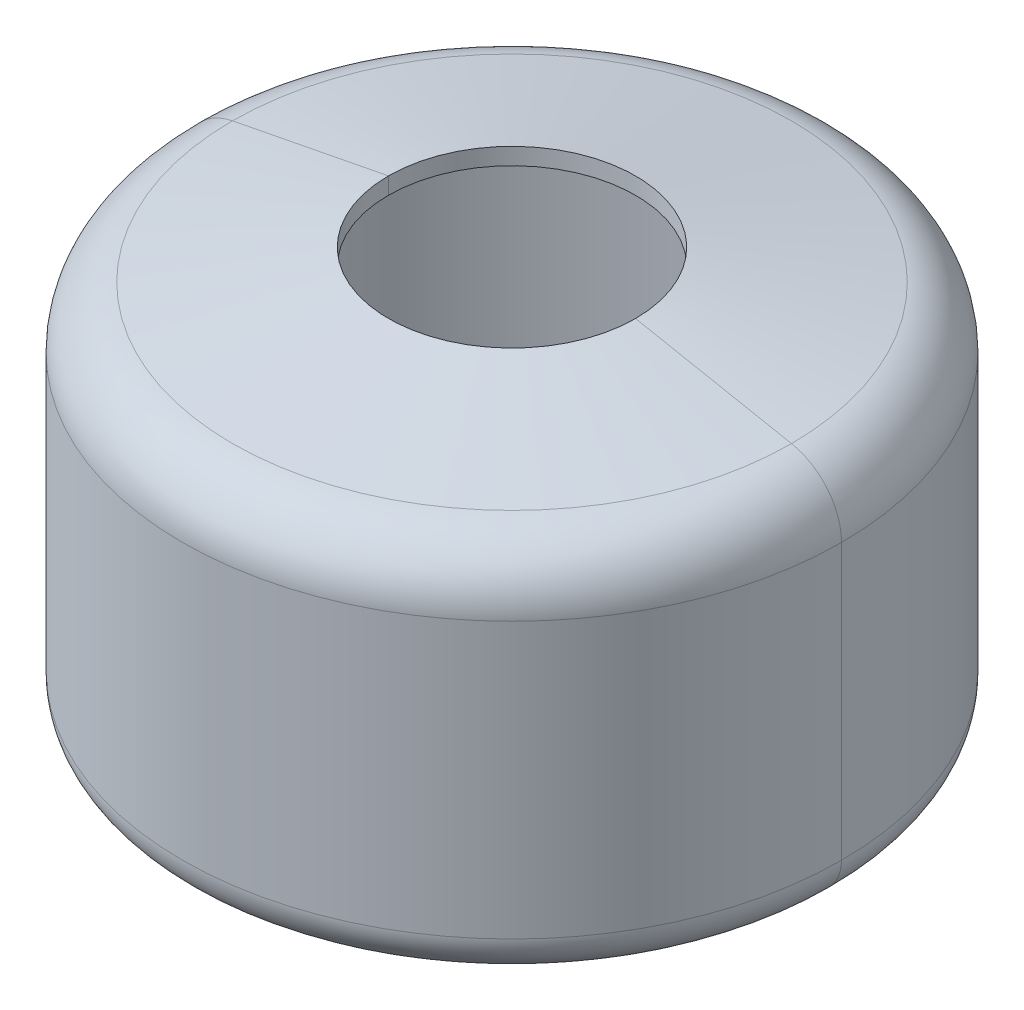
ISO-10303-21;
HEADER;
FILE_DESCRIPTION(('STEP AP214'),'2;1');
FILE_NAME('part.step','',(''),(''),'','','');
FILE_SCHEMA(('AUTOMOTIVE_DESIGN { 1 0 10303 214 1 1 1 1 }'));
ENDSEC;
DATA;
#1=APPLICATION_CONTEXT('core data for automotive mechanical design processes');
#2=APPLICATION_PROTOCOL_DEFINITION('international standard','automotive_design',2000,#1);
#3=PRODUCT_CONTEXT('',#1,'mechanical');
#4=PRODUCT('Part','Part','',(#3));
#5=PRODUCT_RELATED_PRODUCT_CATEGORY('part','',(#4));
#6=PRODUCT_DEFINITION_FORMATION('','',#4);
#7=PRODUCT_DEFINITION_CONTEXT('part definition',#1,'design');
#8=PRODUCT_DEFINITION('design','',#6,#7);
#9=PRODUCT_DEFINITION_SHAPE('','',#8);
#10=(LENGTH_UNIT() NAMED_UNIT(*) SI_UNIT(.MILLI.,.METRE.));
#11=(NAMED_UNIT(*) PLANE_ANGLE_UNIT() SI_UNIT($,.RADIAN.));
#12=(NAMED_UNIT(*) SI_UNIT($,.STERADIAN.) SOLID_ANGLE_UNIT());
#13=UNCERTAINTY_MEASURE_WITH_UNIT(LENGTH_MEASURE(1.E-05),#10,'distance_accuracy_value','');
#14=(GEOMETRIC_REPRESENTATION_CONTEXT(3) GLOBAL_UNCERTAINTY_ASSIGNED_CONTEXT((#13)) GLOBAL_UNIT_ASSIGNED_CONTEXT((#10,
#11,#12)) REPRESENTATION_CONTEXT('',''));
#15=CARTESIAN_POINT('',(0.,0.,0.));
#16=DIRECTION('',(0.,0.,1.));
#17=DIRECTION('',(1.,0.,0.));
#18=AXIS2_PLACEMENT_3D('',#15,#16,#17);
#19=CARTESIAN_POINT('',(0.,-4.999930684396,0.));
#20=DIRECTION('',(0.,-1.,0.));
#21=DIRECTION('',(1.,0.,0.));
#22=AXIS2_PLACEMENT_3D('',#19,#20,#21);
#23=CONICAL_SURFACE('',#22,2.97411809549,0.2617993877991);
#24=CARTESIAN_POINT('',(0.,-4.903338101767,0.));
#25=DIRECTION('',(0.,1.,0.));
#26=DIRECTION('',(-1.,0.,0.));
#27=AXIS2_PLACEMENT_3D('',#24,#25,#26);
#28=CIRCLE('',#27,2.948236190979);
#29=CARTESIAN_POINT('',(-2.948236190979,-4.903338101767,0.));
#30=VERTEX_POINT('',#29);
#31=CARTESIAN_POINT('',(2.948236190979,-4.903338101767,0.));
#32=VERTEX_POINT('',#31);
#33=EDGE_CURVE('E202',#30,#32,#28,.T.);
#34=ORIENTED_EDGE('',*,*,#33,.T.);
#35=DIRECTION('',(0.258819045102494,-0.965925826289076,0.));
#36=VECTOR('',#35,1.);
#37=CARTESIAN_POINT('',(2.948236190979,-4.903338101767,0.));
#38=LINE('',#37,#36);
#39=CARTESIAN_POINT('',(3.,-5.096523267025,0.));
#40=VERTEX_POINT('',#39);
#41=EDGE_CURVE('E26',#32,#40,#38,.T.);
#42=ORIENTED_EDGE('',*,*,#41,.T.);
#43=CARTESIAN_POINT('',(0.,-5.096523267025,0.));
#44=DIRECTION('',(0.,1.,0.));
#45=DIRECTION('',(-1.,0.,0.));
#46=AXIS2_PLACEMENT_3D('',#43,#44,#45);
#47=CIRCLE('',#46,3.);
#48=CARTESIAN_POINT('',(-3.,-5.096523267025,0.));
#49=VERTEX_POINT('',#48);
#50=EDGE_CURVE('E184',#49,#40,#47,.T.);
#51=ORIENTED_EDGE('',*,*,#50,.F.);
#52=DIRECTION('',(-0.258819045102494,-0.965925826289076,0.));
#53=VECTOR('',#52,1.);
#54=CARTESIAN_POINT('',(-2.948236190979,-4.903338101767,0.));
#55=LINE('',#54,#53);
#56=EDGE_CURVE('E11',#30,#49,#55,.T.);
#57=ORIENTED_EDGE('',*,*,#56,.F.);
#58=EDGE_LOOP('',(#34,#42,#51,#57));
#59=FACE_BOUND('',#58,.T.);
#60=ADVANCED_FACE('F16',(#59),#23,.F.);
#61=CARTESIAN_POINT('',(0.,-4.999930684396,0.));
#62=DIRECTION('',(0.,-1.,0.));
#63=DIRECTION('',(1.,0.,0.));
#64=AXIS2_PLACEMENT_3D('',#61,#62,#63);
#65=CONICAL_SURFACE('',#64,2.97411809549,0.2617993877991);
#66=CARTESIAN_POINT('',(0.,-5.096523267025,0.));
#67=DIRECTION('',(0.,-1.,0.));
#68=DIRECTION('',(-1.,0.,0.));
#69=AXIS2_PLACEMENT_3D('',#66,#67,#68);
#70=CIRCLE('',#69,3.);
#71=EDGE_CURVE('E178',#49,#40,#70,.T.);
#72=ORIENTED_EDGE('',*,*,#71,.T.);
#73=ORIENTED_EDGE('',*,*,#41,.F.);
#74=CARTESIAN_POINT('',(0.,-4.903338101767,0.));
#75=DIRECTION('',(0.,-1.,0.));
#76=DIRECTION('',(-1.,0.,0.));
#77=AXIS2_PLACEMENT_3D('',#74,#75,#76);
#78=CIRCLE('',#77,2.948236190979);
#79=EDGE_CURVE('E201',#30,#32,#78,.T.);
#80=ORIENTED_EDGE('',*,*,#79,.F.);
#81=ORIENTED_EDGE('',*,*,#56,.T.);
#82=EDGE_LOOP('',(#72,#73,#80,#81));
#83=FACE_BOUND('',#82,.T.);
#84=ADVANCED_FACE('F388',(#83),#65,.F.);
#85=CARTESIAN_POINT('',(0.,-4.819013215129,0.));
#86=DIRECTION('',(0.,1.,0.));
#87=DIRECTION('',(-1.,0.,0.));
#88=AXIS2_PLACEMENT_3D('',#85,#86,#87);
#89=CONICAL_SURFACE('',#88,3.262940952255,1.3089969389955);
#90=ORIENTED_EDGE('',*,*,#79,.T.);
#91=DIRECTION('',(-0.965925826289076,-0.258819045102494,0.));
#92=VECTOR('',#91,1.);
#93=CARTESIAN_POINT('',(3.577645713531,-4.734688328491,0.));
#94=LINE('',#93,#92);
#95=CARTESIAN_POINT('',(3.577645713531,-4.734688328491,0.));
#96=VERTEX_POINT('',#95);
#97=EDGE_CURVE('E339',#96,#32,#94,.T.);
#98=ORIENTED_EDGE('',*,*,#97,.F.);
#99=CARTESIAN_POINT('',(0.,-4.734688328491,0.));
#100=DIRECTION('',(0.,-1.,0.));
#101=DIRECTION('',(-1.,0.,0.));
#102=AXIS2_PLACEMENT_3D('',#99,#100,#101);
#103=CIRCLE('',#102,3.577645713531);
#104=CARTESIAN_POINT('',(-3.577645713531,-4.734688328491,0.));
#105=VERTEX_POINT('',#104);
#106=EDGE_CURVE('E316',#105,#96,#103,.T.);
#107=ORIENTED_EDGE('',*,*,#106,.F.);
#108=DIRECTION('',(0.965925826289076,-0.258819045102494,0.));
#109=VECTOR('',#108,1.);
#110=CARTESIAN_POINT('',(-3.577645713531,-4.734688328491,0.));
#111=LINE('',#110,#109);
#112=EDGE_CURVE('E197',#105,#30,#111,.T.);
#113=ORIENTED_EDGE('',*,*,#112,.T.);
#114=EDGE_LOOP('',(#90,#98,#107,#113));
#115=FACE_BOUND('',#114,.T.);
#116=ADVANCED_FACE('F392',(#115),#89,.F.);
#117=CARTESIAN_POINT('',(0.,-4.819013215129,0.));
#118=DIRECTION('',(0.,1.,0.));
#119=DIRECTION('',(-1.,0.,0.));
#120=AXIS2_PLACEMENT_3D('',#117,#118,#119);
#121=CONICAL_SURFACE('',#120,3.262940952255,1.3089969389955);
#122=CARTESIAN_POINT('',(0.,-4.734688328491,0.));
#123=DIRECTION('',(0.,1.,0.));
#124=DIRECTION('',(-1.,0.,0.));
#125=AXIS2_PLACEMENT_3D('',#122,#123,#124);
#126=CIRCLE('',#125,3.577645713531);
#127=EDGE_CURVE('E171',#105,#96,#126,.T.);
#128=ORIENTED_EDGE('',*,*,#127,.T.);
#129=ORIENTED_EDGE('',*,*,#97,.T.);
#130=ORIENTED_EDGE('',*,*,#33,.F.);
#131=ORIENTED_EDGE('',*,*,#112,.F.);
#132=EDGE_LOOP('',(#128,#129,#130,#131));
#133=FACE_BOUND('',#132,.T.);
#134=ADVANCED_FACE('F398',(#133),#121,.F.);
#135=CARTESIAN_POINT('',(0.,-4.444910580604,0.));
#136=DIRECTION('',(0.,-1.,0.));
#137=DIRECTION('',(1.,0.,0.));
#138=AXIS2_PLACEMENT_3D('',#135,#136,#137);
#139=TOROIDAL_SURFACE('',#138,3.5,0.3);
#140=CARTESIAN_POINT('',(0.,-4.444910580604,0.));
#141=DIRECTION('',(0.,1.,0.));
#142=DIRECTION('',(-1.,0.,0.));
#143=AXIS2_PLACEMENT_3D('',#140,#141,#142);
#144=CIRCLE('',#143,3.8);
#145=CARTESIAN_POINT('',(-3.8,-4.444910580604,0.));
#146=VERTEX_POINT('',#145);
#147=CARTESIAN_POINT('',(3.8,-4.444910580604,0.));
#148=VERTEX_POINT('',#147);
#149=EDGE_CURVE('E245',#146,#148,#144,.T.);
#150=ORIENTED_EDGE('',*,*,#149,.T.);
#151=CARTESIAN_POINT('',(3.5,-4.444910580604,0.));
#152=DIRECTION('',(0.,0.,-1.));
#153=DIRECTION('',(1.,0.,0.));
#154=AXIS2_PLACEMENT_3D('',#151,#152,#153);
#155=CIRCLE('',#154,0.3);
#156=EDGE_CURVE('E294',#148,#96,#155,.T.);
#157=ORIENTED_EDGE('',*,*,#156,.T.);
#158=ORIENTED_EDGE('',*,*,#127,.F.);
#159=CARTESIAN_POINT('',(-3.5,-4.444910580604,0.));
#160=DIRECTION('',(0.,0.,1.));
#161=DIRECTION('',(-1.,0.,0.));
#162=AXIS2_PLACEMENT_3D('',#159,#160,#161);
#163=CIRCLE('',#162,0.3);
#164=EDGE_CURVE('E323',#146,#105,#163,.T.);
#165=ORIENTED_EDGE('',*,*,#164,.F.);
#166=EDGE_LOOP('',(#150,#157,#158,#165));
#167=FACE_BOUND('',#166,.T.);
#168=ADVANCED_FACE('F320',(#167),#139,.F.);
#169=CARTESIAN_POINT('',(0.,-4.444910580604,0.));
#170=DIRECTION('',(0.,-1.,0.));
#171=DIRECTION('',(1.,0.,0.));
#172=AXIS2_PLACEMENT_3D('',#169,#170,#171);
#173=TOROIDAL_SURFACE('',#172,3.5,0.3);
#174=ORIENTED_EDGE('',*,*,#106,.T.);
#175=ORIENTED_EDGE('',*,*,#156,.F.);
#176=CARTESIAN_POINT('',(0.,-4.444910580604,0.));
#177=DIRECTION('',(0.,-1.,0.));
#178=DIRECTION('',(-1.,0.,0.));
#179=AXIS2_PLACEMENT_3D('',#176,#177,#178);
#180=CIRCLE('',#179,3.8);
#181=EDGE_CURVE('E310',#146,#148,#180,.T.);
#182=ORIENTED_EDGE('',*,*,#181,.F.);
#183=ORIENTED_EDGE('',*,*,#164,.T.);
#184=EDGE_LOOP('',(#174,#175,#182,#183));
#185=FACE_BOUND('',#184,.T.);
#186=ADVANCED_FACE('F430',(#185),#173,.F.);
#187=CARTESIAN_POINT('',(0.,0.2548261633512,0.));
#188=DIRECTION('',(0.,-1.,0.));
#189=DIRECTION('',(1.,0.,0.));
#190=AXIS2_PLACEMENT_3D('',#187,#188,#189);
#191=CYLINDRICAL_SURFACE('',#190,3.8);
#192=ORIENTED_EDGE('',*,*,#181,.T.);
#193=DIRECTION('',(0.,-1.,0.));
#194=VECTOR('',#193,1.);
#195=CARTESIAN_POINT('',(3.8,-1.104203062207,0.));
#196=LINE('',#195,#194);
#197=CARTESIAN_POINT('',(3.8,-1.104203062207,0.));
#198=VERTEX_POINT('',#197);
#199=EDGE_CURVE('E241',#198,#148,#196,.T.);
#200=ORIENTED_EDGE('',*,*,#199,.F.);
#201=CARTESIAN_POINT('',(0.,-1.104203062207,0.));
#202=DIRECTION('',(0.,-1.,0.));
#203=DIRECTION('',(-1.,0.,0.));
#204=AXIS2_PLACEMENT_3D('',#201,#202,#203);
#205=CIRCLE('',#204,3.8);
#206=CARTESIAN_POINT('',(-3.8,-1.104203062207,0.));
#207=VERTEX_POINT('',#206);
#208=EDGE_CURVE('E237',#207,#198,#205,.T.);
#209=ORIENTED_EDGE('',*,*,#208,.F.);
#210=DIRECTION('',(0.,-1.,0.));
#211=VECTOR('',#210,1.);
#212=CARTESIAN_POINT('',(-3.8,-1.104203062207,0.));
#213=LINE('',#212,#211);
#214=EDGE_CURVE('E303',#207,#146,#213,.T.);
#215=ORIENTED_EDGE('',*,*,#214,.T.);
#216=EDGE_LOOP('',(#192,#200,#209,#215));
#217=FACE_BOUND('',#216,.T.);
#218=ADVANCED_FACE('F308',(#217),#191,.F.);
#219=CARTESIAN_POINT('',(0.,0.2548261633512,0.));
#220=DIRECTION('',(0.,-1.,0.));
#221=DIRECTION('',(1.,0.,0.));
#222=AXIS2_PLACEMENT_3D('',#219,#220,#221);
#223=CYLINDRICAL_SURFACE('',#222,3.8);
#224=CARTESIAN_POINT('',(0.,-1.104203062207,0.));
#225=DIRECTION('',(0.,1.,0.));
#226=DIRECTION('',(-1.,0.,0.));
#227=AXIS2_PLACEMENT_3D('',#224,#225,#226);
#228=CIRCLE('',#227,3.8);
#229=EDGE_CURVE('E222',#207,#198,#228,.T.);
#230=ORIENTED_EDGE('',*,*,#229,.T.);
#231=ORIENTED_EDGE('',*,*,#199,.T.);
#232=ORIENTED_EDGE('',*,*,#149,.F.);
#233=ORIENTED_EDGE('',*,*,#214,.F.);
#234=EDGE_LOOP('',(#230,#231,#232,#233));
#235=FACE_BOUND('',#234,.T.);
#236=ADVANCED_FACE('F300',(#235),#223,.F.);
#237=CARTESIAN_POINT('',(0.,-1.104203062207,0.));
#238=DIRECTION('',(0.,-1.,0.));
#239=DIRECTION('',(1.,0.,0.));
#240=AXIS2_PLACEMENT_3D('',#237,#238,#239);
#241=TOROIDAL_SURFACE('',#240,3.25,0.55);
#242=CARTESIAN_POINT('',(0.,-0.5643081113112,0.));
#243=DIRECTION('',(0.,1.,0.));
#244=DIRECTION('',(-1.,0.,0.));
#245=AXIS2_PLACEMENT_3D('',#242,#243,#244);
#246=CIRCLE('',#245,3.354944947457);
#247=CARTESIAN_POINT('',(-3.354944947457,-0.5643081113112,0.));
#248=VERTEX_POINT('',#247);
#249=CARTESIAN_POINT('',(3.354944947457,-0.5643081113112,0.));
#250=VERTEX_POINT('',#249);
#251=EDGE_CURVE('E195',#248,#250,#246,.T.);
#252=ORIENTED_EDGE('',*,*,#251,.T.);
#253=CARTESIAN_POINT('',(3.25,-1.104203062207,0.));
#254=DIRECTION('',(0.,0.,-1.));
#255=DIRECTION('',(0.190808995376495,0.981627183447674,0.));
#256=AXIS2_PLACEMENT_3D('',#253,#254,#255);
#257=CIRCLE('',#256,0.55);
#258=EDGE_CURVE('E223',#250,#198,#257,.T.);
#259=ORIENTED_EDGE('',*,*,#258,.T.);
#260=ORIENTED_EDGE('',*,*,#229,.F.);
#261=CARTESIAN_POINT('',(-3.25,-1.104203062207,0.));
#262=DIRECTION('',(0.,0.,1.));
#263=DIRECTION('',(-0.190808995376495,0.981627183447674,0.));
#264=AXIS2_PLACEMENT_3D('',#261,#262,#263);
#265=CIRCLE('',#264,0.55);
#266=EDGE_CURVE('E218',#248,#207,#265,.T.);
#267=ORIENTED_EDGE('',*,*,#266,.F.);
#268=EDGE_LOOP('',(#252,#259,#260,#267));
#269=FACE_BOUND('',#268,.T.);
#270=ADVANCED_FACE('F267',(#269),#241,.F.);
#271=CARTESIAN_POINT('',(0.,-1.104203062207,0.));
#272=DIRECTION('',(0.,-1.,0.));
#273=DIRECTION('',(1.,0.,0.));
#274=AXIS2_PLACEMENT_3D('',#271,#272,#273);
#275=TOROIDAL_SURFACE('',#274,3.25,0.55);
#276=ORIENTED_EDGE('',*,*,#208,.T.);
#277=ORIENTED_EDGE('',*,*,#258,.F.);
#278=CARTESIAN_POINT('',(0.,-0.5643081113112,0.));
#279=DIRECTION('',(0.,-1.,0.));
#280=DIRECTION('',(-1.,0.,0.));
#281=AXIS2_PLACEMENT_3D('',#278,#279,#280);
#282=CIRCLE('',#281,3.354944947457);
#283=EDGE_CURVE('E19',#248,#250,#282,.T.);
#284=ORIENTED_EDGE('',*,*,#283,.F.);
#285=ORIENTED_EDGE('',*,*,#266,.T.);
#286=EDGE_LOOP('',(#276,#277,#284,#285));
#287=FACE_BOUND('',#286,.T.);
#288=ADVANCED_FACE('F305',(#287),#275,.F.);
#289=CARTESIAN_POINT('',(0.,-0.3840257251511,0.));
#290=DIRECTION('',(0.,-1.,0.));
#291=DIRECTION('',(1.,0.,0.));
#292=AXIS2_PLACEMENT_3D('',#289,#290,#291);
#293=CONICAL_SURFACE('',#292,2.427472473729,1.37881010907526);
#294=DIRECTION('',(-0.981627183447674,-0.190808995376495,0.));
#295=VECTOR('',#294,1.);
#296=CARTESIAN_POINT('',(-1.5,-0.203743338991,0.));
#297=LINE('',#296,#295);
#298=CARTESIAN_POINT('',(-1.5,-0.203743338991,0.));
#299=VERTEX_POINT('',#298);
#300=EDGE_CURVE('E227',#299,#248,#297,.T.);
#301=ORIENTED_EDGE('',*,*,#300,.T.);
#302=ORIENTED_EDGE('',*,*,#283,.T.);
#303=DIRECTION('',(0.981627183447674,-0.190808995376495,0.));
#304=VECTOR('',#303,1.);
#305=CARTESIAN_POINT('',(1.5,-0.203743338991,0.));
#306=LINE('',#305,#304);
#307=CARTESIAN_POINT('',(1.5,-0.203743338991,0.));
#308=VERTEX_POINT('',#307);
#309=EDGE_CURVE('E191',#308,#250,#306,.T.);
#310=ORIENTED_EDGE('',*,*,#309,.F.);
#311=CARTESIAN_POINT('',(0.,-0.203743338991,0.));
#312=DIRECTION('',(0.,1.,0.));
#313=DIRECTION('',(1.,0.,0.));
#314=AXIS2_PLACEMENT_3D('',#311,#312,#313);
#315=CIRCLE('',#314,1.5);
#316=EDGE_CURVE('E210',#308,#299,#315,.T.);
#317=ORIENTED_EDGE('',*,*,#316,.T.);
#318=EDGE_LOOP('',(#301,#302,#310,#317));
#319=FACE_BOUND('',#318,.T.);
#320=ADVANCED_FACE('F262',(#319),#293,.F.);
#321=CARTESIAN_POINT('',(0.,-0.3840257251511,0.));
#322=DIRECTION('',(0.,-1.,0.));
#323=DIRECTION('',(1.,0.,0.));
#324=AXIS2_PLACEMENT_3D('',#321,#322,#323);
#325=CONICAL_SURFACE('',#324,2.427472473729,1.37881010907526);
#326=ORIENTED_EDGE('',*,*,#309,.T.);
#327=ORIENTED_EDGE('',*,*,#251,.F.);
#328=ORIENTED_EDGE('',*,*,#300,.F.);
#329=CARTESIAN_POINT('',(0.,-0.203743338991,0.));
#330=DIRECTION('',(0.,1.,0.));
#331=DIRECTION('',(-1.,0.,0.));
#332=AXIS2_PLACEMENT_3D('',#329,#330,#331);
#333=CIRCLE('',#332,1.5);
#334=EDGE_CURVE('E272',#299,#308,#333,.T.);
#335=ORIENTED_EDGE('',*,*,#334,.T.);
#336=EDGE_LOOP('',(#326,#327,#328,#335));
#337=FACE_BOUND('',#336,.T.);
#338=ADVANCED_FACE('F270',(#337),#325,.F.);
#339=CARTESIAN_POINT('',(0.,-0.1839913373108,0.));
#340=DIRECTION('',(0.,-1.,0.));
#341=DIRECTION('',(1.,0.,0.));
#342=AXIS2_PLACEMENT_3D('',#339,#340,#341);
#343=CONICAL_SURFACE('',#342,2.446553373266,1.37881010907526);
#344=DIRECTION('',(0.981627183447674,0.190808995376495,0.));
#345=VECTOR('',#344,1.);
#346=CARTESIAN_POINT('',(-3.393106746532,-0.3679826746217,0.));
#347=LINE('',#346,#345);
#348=CARTESIAN_POINT('',(-3.393106746532,-0.3679826746217,0.));
#349=VERTEX_POINT('',#348);
#350=CARTESIAN_POINT('',(-1.5,0.,0.));
#351=VERTEX_POINT('',#350);
#352=EDGE_CURVE('E140',#349,#351,#347,.T.);
#353=ORIENTED_EDGE('',*,*,#352,.F.);
#354=CARTESIAN_POINT('',(0.,-0.3679826746217,0.));
#355=DIRECTION('',(0.,1.,0.));
#356=DIRECTION('',(-1.,0.,0.));
#357=AXIS2_PLACEMENT_3D('',#354,#355,#356);
#358=CIRCLE('',#357,3.393106746532);
#359=CARTESIAN_POINT('',(3.393106746532,-0.3679826746217,0.));
#360=VERTEX_POINT('',#359);
#361=EDGE_CURVE('E152',#349,#360,#358,.T.);
#362=ORIENTED_EDGE('',*,*,#361,.T.);
#363=DIRECTION('',(-0.981627183447674,0.190808995376495,0.));
#364=VECTOR('',#363,1.);
#365=CARTESIAN_POINT('',(3.393106746532,-0.3679826746217,0.));
#366=LINE('',#365,#364);
#367=CARTESIAN_POINT('',(1.5,0.,0.));
#368=VERTEX_POINT('',#367);
#369=EDGE_CURVE('E129',#360,#368,#366,.T.);
#370=ORIENTED_EDGE('',*,*,#369,.T.);
#371=CARTESIAN_POINT('',(0.,0.,0.));
#372=DIRECTION('',(0.,1.,0.));
#373=DIRECTION('',(-1.,0.,0.));
#374=AXIS2_PLACEMENT_3D('',#371,#372,#373);
#375=CIRCLE('',#374,1.5);
#376=EDGE_CURVE('E196',#351,#368,#375,.T.);
#377=ORIENTED_EDGE('',*,*,#376,.F.);
#378=EDGE_LOOP('',(#353,#362,#370,#377));
#379=FACE_BOUND('',#378,.T.);
#380=ADVANCED_FACE('F153',(#379),#343,.T.);
#381=CARTESIAN_POINT('',(0.,0.,0.));
#382=DIRECTION('',(0.,1.,0.));
#383=DIRECTION('',(1.,0.,0.));
#384=AXIS2_PLACEMENT_3D('',#381,#382,#383);
#385=CYLINDRICAL_SURFACE('',#384,1.5);
#386=DIRECTION('',(0.,-1.,0.));
#387=VECTOR('',#386,1.);
#388=CARTESIAN_POINT('',(1.5,0.,0.));
#389=LINE('',#388,#387);
#390=EDGE_CURVE('E214',#368,#308,#389,.T.);
#391=ORIENTED_EDGE('',*,*,#390,.T.);
#392=ORIENTED_EDGE('',*,*,#334,.F.);
#393=DIRECTION('',(0.,-1.,0.));
#394=VECTOR('',#393,1.);
#395=CARTESIAN_POINT('',(-1.5,0.,0.));
#396=LINE('',#395,#394);
#397=EDGE_CURVE('E215',#351,#299,#396,.T.);
#398=ORIENTED_EDGE('',*,*,#397,.F.);
#399=ORIENTED_EDGE('',*,*,#376,.T.);
#400=EDGE_LOOP('',(#391,#392,#398,#399));
#401=FACE_BOUND('',#400,.T.);
#402=ADVANCED_FACE('F280',(#401),#385,.F.);
#403=CARTESIAN_POINT('',(0.,0.,0.));
#404=DIRECTION('',(0.,1.,0.));
#405=DIRECTION('',(1.,0.,0.));
#406=AXIS2_PLACEMENT_3D('',#403,#404,#405);
#407=CYLINDRICAL_SURFACE('',#406,1.5);
#408=ORIENTED_EDGE('',*,*,#397,.T.);
#409=ORIENTED_EDGE('',*,*,#316,.F.);
#410=ORIENTED_EDGE('',*,*,#390,.F.);
#411=CARTESIAN_POINT('',(0.,0.,0.));
#412=DIRECTION('',(0.,-1.,0.));
#413=DIRECTION('',(-1.,0.,0.));
#414=AXIS2_PLACEMENT_3D('',#411,#412,#413);
#415=CIRCLE('',#414,1.5);
#416=EDGE_CURVE('E136',#351,#368,#415,.T.);
#417=ORIENTED_EDGE('',*,*,#416,.F.);
#418=EDGE_LOOP('',(#408,#409,#410,#417));
#419=FACE_BOUND('',#418,.T.);
#420=ADVANCED_FACE('F284',(#419),#407,.F.);
#421=CARTESIAN_POINT('',(0.,-0.1839913373108,0.));
#422=DIRECTION('',(0.,-1.,0.));
#423=DIRECTION('',(1.,0.,0.));
#424=AXIS2_PLACEMENT_3D('',#421,#422,#423);
#425=CONICAL_SURFACE('',#424,2.446553373266,1.37881010907526);
#426=ORIENTED_EDGE('',*,*,#369,.F.);
#427=CARTESIAN_POINT('',(0.,-0.3679826746217,0.));
#428=DIRECTION('',(0.,-1.,0.));
#429=DIRECTION('',(-1.,0.,0.));
#430=AXIS2_PLACEMENT_3D('',#427,#428,#429);
#431=CIRCLE('',#430,3.393106746532);
#432=EDGE_CURVE('E133',#349,#360,#431,.T.);
#433=ORIENTED_EDGE('',*,*,#432,.F.);
#434=ORIENTED_EDGE('',*,*,#352,.T.);
#435=ORIENTED_EDGE('',*,*,#416,.T.);
#436=EDGE_LOOP('',(#426,#433,#434,#435));
#437=FACE_BOUND('',#436,.T.);
#438=ADVANCED_FACE('F131',(#437),#425,.T.);
#439=CARTESIAN_POINT('',(0.,-1.104203062207,0.));
#440=DIRECTION('',(0.,-1.,0.));
#441=DIRECTION('',(1.,0.,0.));
#442=AXIS2_PLACEMENT_3D('',#439,#440,#441);
#443=TOROIDAL_SURFACE('',#442,3.25,0.75);
#444=ORIENTED_EDGE('',*,*,#432,.T.);
#445=CARTESIAN_POINT('',(3.25,-1.104203062207,0.));
#446=DIRECTION('',(0.,0.,1.));
#447=DIRECTION('',(1.,0.,0.));
#448=AXIS2_PLACEMENT_3D('',#445,#446,#447);
#449=CIRCLE('',#448,0.75);
#450=CARTESIAN_POINT('',(4.,-1.104203062207,0.));
#451=VERTEX_POINT('',#450);
#452=EDGE_CURVE('E146',#451,#360,#449,.T.);
#453=ORIENTED_EDGE('',*,*,#452,.F.);
#454=CARTESIAN_POINT('',(0.,-1.104203062207,0.));
#455=DIRECTION('',(0.,-1.,0.));
#456=DIRECTION('',(-1.,0.,0.));
#457=AXIS2_PLACEMENT_3D('',#454,#455,#456);
#458=CIRCLE('',#457,4.);
#459=CARTESIAN_POINT('',(-4.,-1.104203062207,0.));
#460=VERTEX_POINT('',#459);
#461=EDGE_CURVE('E185',#460,#451,#458,.T.);
#462=ORIENTED_EDGE('',*,*,#461,.F.);
#463=CARTESIAN_POINT('',(-3.25,-1.104203062207,0.));
#464=DIRECTION('',(0.,0.,-1.));
#465=DIRECTION('',(-1.,0.,0.));
#466=AXIS2_PLACEMENT_3D('',#463,#464,#465);
#467=CIRCLE('',#466,0.75);
#468=EDGE_CURVE('E148',#460,#349,#467,.T.);
#469=ORIENTED_EDGE('',*,*,#468,.T.);
#470=EDGE_LOOP('',(#444,#453,#462,#469));
#471=FACE_BOUND('',#470,.T.);
#472=ADVANCED_FACE('F143',(#471),#443,.T.);
#473=CARTESIAN_POINT('',(0.,-1.104203062207,0.));
#474=DIRECTION('',(0.,-1.,0.));
#475=DIRECTION('',(1.,0.,0.));
#476=AXIS2_PLACEMENT_3D('',#473,#474,#475);
#477=TOROIDAL_SURFACE('',#476,3.25,0.75);
#478=CARTESIAN_POINT('',(0.,-1.104203062207,0.));
#479=DIRECTION('',(0.,1.,0.));
#480=DIRECTION('',(-1.,0.,0.));
#481=AXIS2_PLACEMENT_3D('',#478,#479,#480);
#482=CIRCLE('',#481,4.);
#483=EDGE_CURVE('E159',#460,#451,#482,.T.);
#484=ORIENTED_EDGE('',*,*,#483,.T.);
#485=ORIENTED_EDGE('',*,*,#452,.T.);
#486=ORIENTED_EDGE('',*,*,#361,.F.);
#487=ORIENTED_EDGE('',*,*,#468,.F.);
#488=EDGE_LOOP('',(#484,#485,#486,#487));
#489=FACE_BOUND('',#488,.T.);
#490=ADVANCED_FACE('F157',(#489),#477,.T.);
#491=CARTESIAN_POINT('',(0.,0.2548261633512,0.));
#492=DIRECTION('',(0.,-1.,0.));
#493=DIRECTION('',(1.,0.,0.));
#494=AXIS2_PLACEMENT_3D('',#491,#492,#493);
#495=CYLINDRICAL_SURFACE('',#494,4.);
#496=CARTESIAN_POINT('',(0.,-4.444910580604,0.));
#497=DIRECTION('',(0.,1.,0.));
#498=DIRECTION('',(-1.,0.,0.));
#499=AXIS2_PLACEMENT_3D('',#496,#497,#498);
#500=CIRCLE('',#499,4.);
#501=CARTESIAN_POINT('',(-4.,-4.444910580604,0.));
#502=VERTEX_POINT('',#501);
#503=CARTESIAN_POINT('',(4.,-4.444910580604,0.));
#504=VERTEX_POINT('',#503);
#505=EDGE_CURVE('E232',#502,#504,#500,.T.);
#506=ORIENTED_EDGE('',*,*,#505,.T.);
#507=DIRECTION('',(0.,1.,0.));
#508=VECTOR('',#507,1.);
#509=CARTESIAN_POINT('',(4.,-4.444910580604,0.));
#510=LINE('',#509,#508);
#511=EDGE_CURVE('E188',#504,#451,#510,.T.);
#512=ORIENTED_EDGE('',*,*,#511,.T.);
#513=ORIENTED_EDGE('',*,*,#483,.F.);
#514=DIRECTION('',(0.,1.,0.));
#515=VECTOR('',#514,1.);
#516=CARTESIAN_POINT('',(-4.,-4.444910580604,0.));
#517=LINE('',#516,#515);
#518=EDGE_CURVE('E168',#502,#460,#517,.T.);
#519=ORIENTED_EDGE('',*,*,#518,.F.);
#520=EDGE_LOOP('',(#506,#512,#513,#519));
#521=FACE_BOUND('',#520,.T.);
#522=ADVANCED_FACE('F373',(#521),#495,.T.);
#523=CARTESIAN_POINT('',(0.,0.2548261633512,0.));
#524=DIRECTION('',(0.,-1.,0.));
#525=DIRECTION('',(1.,0.,0.));
#526=AXIS2_PLACEMENT_3D('',#523,#524,#525);
#527=CYLINDRICAL_SURFACE('',#526,4.);
#528=ORIENTED_EDGE('',*,*,#461,.T.);
#529=ORIENTED_EDGE('',*,*,#511,.F.);
#530=CARTESIAN_POINT('',(0.,-4.444910580604,0.));
#531=DIRECTION('',(0.,-1.,0.));
#532=DIRECTION('',(-1.,0.,0.));
#533=AXIS2_PLACEMENT_3D('',#530,#531,#532);
#534=CIRCLE('',#533,4.);
#535=EDGE_CURVE('E189',#502,#504,#534,.T.);
#536=ORIENTED_EDGE('',*,*,#535,.F.);
#537=ORIENTED_EDGE('',*,*,#518,.T.);
#538=EDGE_LOOP('',(#528,#529,#536,#537));
#539=FACE_BOUND('',#538,.T.);
#540=ADVANCED_FACE('F375',(#539),#527,.T.);
#541=CARTESIAN_POINT('',(0.,-4.444910580604,0.));
#542=DIRECTION('',(0.,-1.,0.));
#543=DIRECTION('',(1.,0.,0.));
#544=AXIS2_PLACEMENT_3D('',#541,#542,#543);
#545=TOROIDAL_SURFACE('',#544,3.5,0.5);
#546=ORIENTED_EDGE('',*,*,#535,.T.);
#547=CARTESIAN_POINT('',(3.5,-4.444910580604,0.));
#548=DIRECTION('',(0.,0.,1.));
#549=DIRECTION('',(0.258819045102494,-0.965925826289076,0.));
#550=AXIS2_PLACEMENT_3D('',#547,#548,#549);
#551=CIRCLE('',#550,0.5);
#552=CARTESIAN_POINT('',(3.629409522551,-4.927873493749,0.));
#553=VERTEX_POINT('',#552);
#554=EDGE_CURVE('E228',#553,#504,#551,.T.);
#555=ORIENTED_EDGE('',*,*,#554,.F.);
#556=CARTESIAN_POINT('',(0.,-4.927873493749,0.));
#557=DIRECTION('',(0.,-1.,0.));
#558=DIRECTION('',(-1.,0.,0.));
#559=AXIS2_PLACEMENT_3D('',#556,#557,#558);
#560=CIRCLE('',#559,3.629409522551);
#561=CARTESIAN_POINT('',(-3.629409522551,-4.927873493749,0.));
#562=VERTEX_POINT('',#561);
#563=EDGE_CURVE('E179',#562,#553,#560,.T.);
#564=ORIENTED_EDGE('',*,*,#563,.F.);
#565=CARTESIAN_POINT('',(-3.5,-4.444910580604,0.));
#566=DIRECTION('',(0.,0.,-1.));
#567=DIRECTION('',(-0.258819045102494,-0.965925826289076,0.));
#568=AXIS2_PLACEMENT_3D('',#565,#566,#567);
#569=CIRCLE('',#568,0.5);
#570=EDGE_CURVE('E209',#562,#502,#569,.T.);
#571=ORIENTED_EDGE('',*,*,#570,.T.);
#572=EDGE_LOOP('',(#546,#555,#564,#571));
#573=FACE_BOUND('',#572,.T.);
#574=ADVANCED_FACE('F367',(#573),#545,.T.);
#575=CARTESIAN_POINT('',(0.,-4.444910580604,0.));
#576=DIRECTION('',(0.,-1.,0.));
#577=DIRECTION('',(1.,0.,0.));
#578=AXIS2_PLACEMENT_3D('',#575,#576,#577);
#579=TOROIDAL_SURFACE('',#578,3.5,0.5);
#580=CARTESIAN_POINT('',(0.,-4.927873493749,0.));
#581=DIRECTION('',(0.,1.,0.));
#582=DIRECTION('',(-1.,0.,0.));
#583=AXIS2_PLACEMENT_3D('',#580,#581,#582);
#584=CIRCLE('',#583,3.629409522551);
#585=EDGE_CURVE('E233',#562,#553,#584,.T.);
#586=ORIENTED_EDGE('',*,*,#585,.T.);
#587=ORIENTED_EDGE('',*,*,#554,.T.);
#588=ORIENTED_EDGE('',*,*,#505,.F.);
#589=ORIENTED_EDGE('',*,*,#570,.F.);
#590=EDGE_LOOP('',(#586,#587,#588,#589));
#591=FACE_BOUND('',#590,.T.);
#592=ADVANCED_FACE('F371',(#591),#579,.T.);
#593=CARTESIAN_POINT('',(0.,-5.012198380387,0.));
#594=DIRECTION('',(0.,1.,0.));
#595=DIRECTION('',(-1.,0.,0.));
#596=AXIS2_PLACEMENT_3D('',#593,#594,#595);
#597=CONICAL_SURFACE('',#596,3.314704761276,1.3089969389955);
#598=ORIENTED_EDGE('',*,*,#50,.T.);
#599=DIRECTION('',(0.965925826289076,0.258819045102494,0.));
#600=VECTOR('',#599,1.);
#601=CARTESIAN_POINT('',(3.,-5.096523267025,0.));
#602=LINE('',#601,#600);
#603=EDGE_CURVE('E174',#40,#553,#602,.T.);
#604=ORIENTED_EDGE('',*,*,#603,.T.);
#605=ORIENTED_EDGE('',*,*,#585,.F.);
#606=DIRECTION('',(-0.965925826289076,0.258819045102494,0.));
#607=VECTOR('',#606,1.);
#608=CARTESIAN_POINT('',(-3.,-5.096523267025,0.));
#609=LINE('',#608,#607);
#610=EDGE_CURVE('E180',#49,#562,#609,.T.);
#611=ORIENTED_EDGE('',*,*,#610,.F.);
#612=EDGE_LOOP('',(#598,#604,#605,#611));
#613=FACE_BOUND('',#612,.T.);
#614=ADVANCED_FACE('F406',(#613),#597,.T.);
#615=CARTESIAN_POINT('',(0.,-5.012198380387,0.));
#616=DIRECTION('',(0.,1.,0.));
#617=DIRECTION('',(-1.,0.,0.));
#618=AXIS2_PLACEMENT_3D('',#615,#616,#617);
#619=CONICAL_SURFACE('',#618,3.314704761276,1.3089969389955);
#620=ORIENTED_EDGE('',*,*,#563,.T.);
#621=ORIENTED_EDGE('',*,*,#603,.F.);
#622=ORIENTED_EDGE('',*,*,#71,.F.);
#623=ORIENTED_EDGE('',*,*,#610,.T.);
#624=EDGE_LOOP('',(#620,#621,#622,#623));
#625=FACE_BOUND('',#624,.T.);
#626=ADVANCED_FACE('F404',(#625),#619,.T.);
#627=CLOSED_SHELL('',(#60,#84,#116,#134,#168,#186,#218,#236,#270,#288,#320,#338,#380,#402,#420,
#438,#472,#490,#522,#540,#574,#592,#614,#626));
#628=MANIFOLD_SOLID_BREP('B1',#627);
#629=ADVANCED_BREP_SHAPE_REPRESENTATION('',(#18,#628),#14);
#630=SHAPE_DEFINITION_REPRESENTATION(#9,#629);
ENDSEC;
END-ISO-10303-21;
